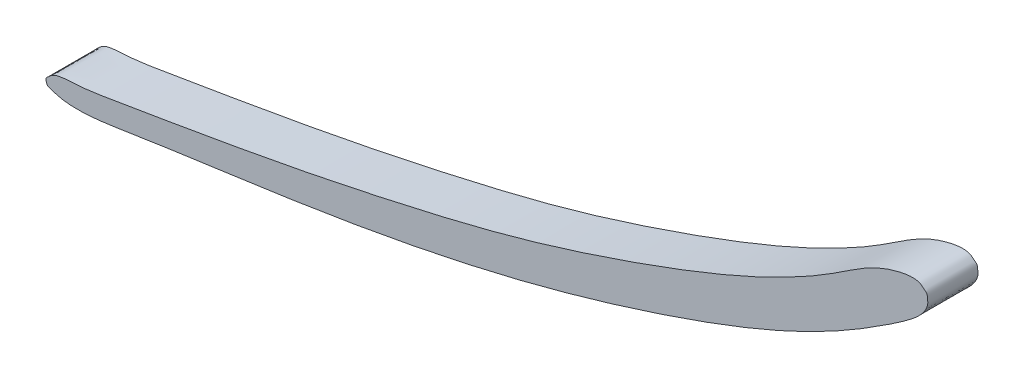
ISO-10303-21;
HEADER;
FILE_DESCRIPTION(('STEP AP214'),'2;1');
FILE_NAME('part.step','',(''),(''),'','','');
FILE_SCHEMA(('AUTOMOTIVE_DESIGN { 1 0 10303 214 1 1 1 1 }'));
ENDSEC;
DATA;
#1=APPLICATION_CONTEXT('core data for automotive mechanical design processes');
#2=APPLICATION_PROTOCOL_DEFINITION('international standard','automotive_design',2000,#1);
#3=PRODUCT_CONTEXT('',#1,'mechanical');
#4=PRODUCT('Part','Part','',(#3));
#5=PRODUCT_RELATED_PRODUCT_CATEGORY('part','',(#4));
#6=PRODUCT_DEFINITION_FORMATION('','',#4);
#7=PRODUCT_DEFINITION_CONTEXT('part definition',#1,'design');
#8=PRODUCT_DEFINITION('design','',#6,#7);
#9=PRODUCT_DEFINITION_SHAPE('','',#8);
#10=(LENGTH_UNIT() NAMED_UNIT(*) SI_UNIT(.MILLI.,.METRE.));
#11=(NAMED_UNIT(*) PLANE_ANGLE_UNIT() SI_UNIT($,.RADIAN.));
#12=(NAMED_UNIT(*) SI_UNIT($,.STERADIAN.) SOLID_ANGLE_UNIT());
#13=UNCERTAINTY_MEASURE_WITH_UNIT(LENGTH_MEASURE(1.E-05),#10,'distance_accuracy_value','');
#14=(GEOMETRIC_REPRESENTATION_CONTEXT(3) GLOBAL_UNCERTAINTY_ASSIGNED_CONTEXT((#13)) GLOBAL_UNIT_ASSIGNED_CONTEXT((#10,
#11,#12)) REPRESENTATION_CONTEXT('',''));
#15=CARTESIAN_POINT('',(0.,0.,0.));
#16=DIRECTION('',(0.,0.,1.));
#17=DIRECTION('',(1.,0.,0.));
#18=AXIS2_PLACEMENT_3D('',#15,#16,#17);
#19=CARTESIAN_POINT('',(84.9771446349662,0.,300.));
#20=CARTESIAN_POINT('',(84.9376325896972,0.0930859776475884,300.));
#21=CARTESIAN_POINT('',(84.866558012268,0.164900258516924,300.));
#22=CARTESIAN_POINT('',(84.7197326632343,0.299874831501848,300.));
#23=CARTESIAN_POINT('',(84.6423906662076,0.362790942592253,300.));
#24=CARTESIAN_POINT('',(84.4144135615283,0.556249545859326,300.));
#25=CARTESIAN_POINT('',(84.2625021657616,0.68714906267718,300.));
#26=CARTESIAN_POINT('',(84.0164333167326,0.853211526667667,300.));
#27=CARTESIAN_POINT('',(83.9317507670341,0.903849060375523,300.));
#28=CARTESIAN_POINT('',(83.7530700213341,0.988603458442093,300.));
#29=CARTESIAN_POINT('',(83.658539371191,1.02352718001817,300.));
#30=CARTESIAN_POINT('',(83.3700965774024,1.10629901206943,300.));
#31=CARTESIAN_POINT('',(83.1738966304029,1.13265599270806,300.));
#32=CARTESIAN_POINT('',(82.7777030243565,1.15736538586336,300.));
#33=CARTESIAN_POINT('',(82.5773526868236,1.15477537073554,300.));
#34=CARTESIAN_POINT('',(82.1817563658688,1.13505252723554,300.));
#35=CARTESIAN_POINT('',(81.9852938780456,1.11719832651085,300.));
#36=CARTESIAN_POINT('',(81.3994189323479,1.04261651869395,300.));
#37=CARTESIAN_POINT('',(81.0131722697718,0.96694452278221,300.));
#38=CARTESIAN_POINT('',(80.244761884589,0.791167870278928,300.));
#39=CARTESIAN_POINT('',(79.8618140904548,0.688833530788997,300.));
#40=CARTESIAN_POINT('',(79.105910434372,0.460950012632982,300.));
#41=CARTESIAN_POINT('',(78.733294882838,0.335999011476674,300.));
#42=CARTESIAN_POINT('',(77.6306035102437,-0.0701207691458209,300.));
#43=CARTESIAN_POINT('',(76.9162105618885,-0.383644795168771,300.));
#44=CARTESIAN_POINT('',(74.8317995544902,-1.44546046891613,300.));
#45=CARTESIAN_POINT('',(73.5145945461823,-2.30278701936392,300.));
#46=CARTESIAN_POINT('',(71.5456953012737,-3.60271578535651,300.));
#47=CARTESIAN_POINT('',(70.88975405836,-4.03675729397341,300.));
#48=CARTESIAN_POINT('',(69.5699012624653,-4.88856822954685,300.));
#49=CARTESIAN_POINT('',(68.906450999426,-5.3072794200656,300.));
#50=CARTESIAN_POINT('',(66.8978301359272,-6.52611304472367,300.));
#51=CARTESIAN_POINT('',(65.5358677387982,-7.29195356456794,300.));
#52=CARTESIAN_POINT('',(62.7828004318539,-8.764137628327,300.));
#53=CARTESIAN_POINT('',(61.3915859679051,-9.47025750794363,300.));
#54=CARTESIAN_POINT('',(58.5868512966658,-10.8369581508706,300.));
#55=CARTESIAN_POINT('',(57.1725614333965,-11.4959675945166,300.));
#56=CARTESIAN_POINT('',(54.321098644822,-12.7672687191436,300.));
#57=CARTESIAN_POINT('',(52.8843392738792,-13.3804047073471,300.));
#58=CARTESIAN_POINT('',(48.5485751516485,-15.1677807657089,300.));
#59=CARTESIAN_POINT('',(45.6248128434252,-16.2935228877004,300.));
#60=CARTESIAN_POINT('',(39.7397747300732,-18.4595659588936,300.));
#61=CARTESIAN_POINT('',(36.7803399862011,-19.4965308587253,300.));
#62=CARTESIAN_POINT('',(30.8364624773511,-21.4933340248129,300.));
#63=CARTESIAN_POINT('',(27.8525329429936,-22.4535798785453,300.));
#64=CARTESIAN_POINT('',(21.8521034457211,-24.27042958252,300.));
#65=CARTESIAN_POINT('',(18.8336834802562,-25.1236965513815,300.));
#66=CARTESIAN_POINT('',(12.7710550733762,-26.7220107800702,300.));
#67=CARTESIAN_POINT('',(9.72643445547307,-27.4683886409884,300.));
#68=CARTESIAN_POINT('',(3.6215124993033,-28.8989475391605,300.));
#69=CARTESIAN_POINT('',(0.56196516582451,-29.5854321913471,300.));
#70=CARTESIAN_POINT('',(-5.56502059829693,-30.9186426334031,300.));
#71=CARTESIAN_POINT('',(-8.63324977001596,-31.5632638157014,300.));
#72=CARTESIAN_POINT('',(-14.7804008535013,-32.8028745850444,300.));
#73=CARTESIAN_POINT('',(-17.8589302331098,-33.3962812159395,300.));
#74=CARTESIAN_POINT('',(-24.0251266928308,-34.5342554983232,300.));
#75=CARTESIAN_POINT('',(-27.1124240991927,-35.0810875197353,300.));
#76=CARTESIAN_POINT('',(-33.2905772093011,-36.1543440573517,300.));
#77=CARTESIAN_POINT('',(-36.3812654291625,-36.6816800630318,300.));
#78=CARTESIAN_POINT('',(-41.0180780447079,-37.4680162138891,300.));
#79=CARTESIAN_POINT('',(-42.5641390301682,-37.7274205301171,300.));
#80=CARTESIAN_POINT('',(-44.8845707321848,-38.1084529392512,300.));
#81=CARTESIAN_POINT('',(-45.6579658086213,-38.2359863588061,300.));
#82=CARTESIAN_POINT('',(-47.2062258440883,-38.4817030562119,300.));
#83=CARTESIAN_POINT('',(-47.9820073901507,-38.5972411057274,300.));
#84=CARTESIAN_POINT('',(-49.538110817668,-38.7812880257337,300.));
#85=CARTESIAN_POINT('',(-50.3182305121755,-38.8495687425065,300.));
#86=CARTESIAN_POINT('',(-51.491704846137,-38.9141619001389,300.));
#87=CARTESIAN_POINT('',(-51.8834999893309,-38.9319379566898,300.));
#88=CARTESIAN_POINT('',(-52.6631013919235,-38.9972294873429,300.));
#89=CARTESIAN_POINT('',(-53.0507008777088,-39.0412334351955,300.));
#90=CARTESIAN_POINT('',(-53.6208271323259,-39.165407444721,300.));
#91=CARTESIAN_POINT('',(-53.8088589770117,-39.2171715388468,300.));
#92=CARTESIAN_POINT('',(-54.1779577557488,-39.3566383827501,300.));
#93=CARTESIAN_POINT('',(-54.3571544162927,-39.4457454962575,300.));
#94=CARTESIAN_POINT('',(-54.6857138713909,-39.6599024882452,300.));
#95=CARTESIAN_POINT('',(-54.8395037210446,-39.7826492948644,300.));
#96=CARTESIAN_POINT('',(-55.0619862980175,-39.9790207988161,300.));
#97=CARTESIAN_POINT('',(-55.136168961009,-40.0445188101506,300.));
#98=CARTESIAN_POINT('',(-55.2793957616962,-40.1810147548545,300.));
#99=CARTESIAN_POINT('',(-55.3501020785358,-40.250946227061,300.));
#100=CARTESIAN_POINT('',(-55.4289720375346,-40.3776261703138,300.));
#101=CARTESIAN_POINT('',(-55.4490411552293,-40.4226391349302,300.));
#102=CARTESIAN_POINT('',(-55.4715465373486,-40.5194301459514,300.));
#103=CARTESIAN_POINT('',(-55.4744405832507,-40.5690045459335,300.));
#104=CARTESIAN_POINT('',(-55.4679190855987,-40.7166887430779,300.));
#105=CARTESIAN_POINT('',(-55.4448174277775,-40.8137763116324,300.));
#106=CARTESIAN_POINT('',(-55.3923292373281,-41.0031256287222,300.));
#107=CARTESIAN_POINT('',(-55.3619092650003,-41.0979944371105,300.));
#108=CARTESIAN_POINT('',(-55.271967798988,-41.273212021774,300.));
#109=CARTESIAN_POINT('',(-55.206745335113,-41.3514819357863,300.));
#110=CARTESIAN_POINT('',(-55.0356883292095,-41.4536012578485,300.));
#111=CARTESIAN_POINT('',(-54.9405601794301,-41.478138877241,300.));
#112=CARTESIAN_POINT('',(-54.7513899157423,-41.5269082833019,300.));
#113=CARTESIAN_POINT('',(-54.656991411335,-41.551801110247,300.));
#114=CARTESIAN_POINT('',(-54.3753173947961,-41.6319078434269,300.));
#115=CARTESIAN_POINT('',(-54.1897455613133,-41.6937998687081,300.));
#116=CARTESIAN_POINT('',(-53.8173796025099,-41.8128914825379,300.));
#117=CARTESIAN_POINT('',(-53.630403228756,-41.8693914106483,300.));
#118=CARTESIAN_POINT('',(-53.2514970052677,-41.9633746360396,300.));
#119=CARTESIAN_POINT('',(-53.0598285368258,-42.001861388584,300.));
#120=CARTESIAN_POINT('',(-52.4804260042969,-42.1004408649109,300.));
#121=CARTESIAN_POINT('',(-52.0916240968118,-42.1417814357258,300.));
#122=CARTESIAN_POINT('',(-50.93118963316,-42.2308310088091,300.));
#123=CARTESIAN_POINT('',(-50.1596518014517,-42.2360744620239,300.));
#124=CARTESIAN_POINT('',(-48.6196425931976,-42.1669670911243,300.));
#125=CARTESIAN_POINT('',(-47.8510981429154,-42.094513001492,300.));
#126=CARTESIAN_POINT('',(-46.3152190154037,-41.9182034135112,300.));
#127=CARTESIAN_POINT('',(-45.5477066729545,-41.8129926974635,300.));
#128=CARTESIAN_POINT('',(-43.2476069822877,-41.4794572556816,300.));
#129=CARTESIAN_POINT('',(-41.7172258487907,-41.2371272701866,300.));
#130=CARTESIAN_POINT('',(-38.6539342513886,-40.7692026629085,300.));
#131=CARTESIAN_POINT('',(-37.1214642438679,-40.5406285918074,300.));
#132=CARTESIAN_POINT('',(-32.5209606344463,-39.8767584760173,300.));
#133=CARTESIAN_POINT('',(-29.4505925645386,-39.4576012866095,300.));
#134=CARTESIAN_POINT('',(-23.3118192098203,-38.6057053528583,300.));
#135=CARTESIAN_POINT('',(-20.2433613892938,-38.1736918175599,300.));
#136=CARTESIAN_POINT('',(-11.04880325248,-36.8070255887844,300.));
#137=CARTESIAN_POINT('',(-4.9319100127467,-35.8008028634233,300.));
#138=CARTESIAN_POINT('',(7.24834813249166,-33.492575457836,300.));
#139=CARTESIAN_POINT('',(13.3121697935028,-32.1938332666301,300.));
#140=CARTESIAN_POINT('',(25.345409445514,-29.2191754580631,300.));
#141=CARTESIAN_POINT('',(31.316238608083,-27.5430370446146,300.));
#142=CARTESIAN_POINT('',(40.1903196139511,-24.7692964175808,300.));
#143=CARTESIAN_POINT('',(43.1359193713343,-23.8024161108653,300.));
#144=CARTESIAN_POINT('',(48.9909662648283,-21.7725789819534,300.));
#145=CARTESIAN_POINT('',(51.9016078482012,-20.7105550780109,300.));
#146=CARTESIAN_POINT('',(57.6726827579912,-18.4464115391916,300.));
#147=CARTESIAN_POINT('',(60.5308669735177,-17.2453625712614,300.));
#148=CARTESIAN_POINT('',(66.1527300618198,-14.6373269703479,300.));
#149=CARTESIAN_POINT('',(68.9165389957067,-13.2260336972963,300.));
#150=CARTESIAN_POINT('',(74.3111862531582,-10.1704170614425,300.));
#151=CARTESIAN_POINT('',(76.9439455989904,-8.52680577070169,300.));
#152=CARTESIAN_POINT('',(80.1586328343634,-6.36116801998172,300.));
#153=CARTESIAN_POINT('',(80.7982061573963,-5.92262525758618,300.));
#154=CARTESIAN_POINT('',(81.7422176701925,-5.24391096078316,300.));
#155=CARTESIAN_POINT('',(82.0537041363697,-5.01330238364296,300.));
#156=CARTESIAN_POINT('',(82.6658868732541,-4.53727437822524,300.));
#157=CARTESIAN_POINT('',(82.9666380284635,-4.29285597419744,300.));
#158=CARTESIAN_POINT('',(83.5427396999458,-3.7783632631757,300.));
#159=CARTESIAN_POINT('',(83.8184478046357,-3.5082811754936,300.));
#160=CARTESIAN_POINT('',(84.3271657392073,-2.92371324399608,300.));
#161=CARTESIAN_POINT('',(84.5586186327069,-2.60655584994662,300.));
#162=CARTESIAN_POINT('',(84.8390339395576,-2.09776670116639,300.));
#163=CARTESIAN_POINT('',(84.9227257281224,-1.92096148548556,300.));
#164=CARTESIAN_POINT('',(85.05127879664,-1.55191923846991,300.));
#165=CARTESIAN_POINT('',(85.0961742702333,-1.36320120662389,300.));
#166=CARTESIAN_POINT('',(85.1137085898208,-0.970118195218622,300.));
#167=CARTESIAN_POINT('',(85.0833613645896,-0.774977119927098,300.));
#168=CARTESIAN_POINT('',(85.0441208025226,-0.483260492620629,300.));
#169=CARTESIAN_POINT('',(85.0354551205903,-0.3856180459147,300.));
#170=CARTESIAN_POINT('',(85.0200086601555,-0.190160835975641,300.));
#171=CARTESIAN_POINT('',(85.0166566802352,-0.0930859776475801,300.));
#172=CARTESIAN_POINT('',(84.9771446349662,0.,300.));
#173=B_SPLINE_CURVE_WITH_KNOTS('',3,(#19,#20,#21,#22,#23,#24,#25,#26,#27,#28,#29,#30,#31,#32,
#33,#34,#35,#36,#37,#38,#39,#40,#41,#42,#43,#44,#45,#46,#47,#48,#49,#50,#51,#52,#53,#54,#55,#56,
#57,#58,#59,#60,#61,#62,#63,#64,#65,#66,#67,#68,#69,#70,#71,#72,#73,#74,#75,#76,#77,#78,#79,#80,
#81,#82,#83,#84,#85,#86,#87,#88,#89,#90,#91,#92,#93,#94,#95,#96,#97,#98,#99,#100,#101,#102,#103,
#104,#105,#106,#107,#108,#109,#110,#111,#112,#113,#114,#115,#116,#117,#118,#119,#120,#121,#122,
#123,#124,#125,#126,#127,#128,#129,#130,#131,#132,#133,#134,#135,#136,#137,#138,#139,#140,#141,
#142,#143,#144,#145,#146,#147,#148,#149,#150,#151,#152,#153,#154,#155,#156,#157,#158,#159,#160,
#161,#162,#163,#164,#165,#166,#167,#168,#169,#170,#171,#172),.UNSPECIFIED.,.T.,.F.,(4,2,2,2,2,2,
2,2,2,2,2,2,2,2,2,2,2,2,2,2,2,2,2,2,2,2,2,2,2,2,2,2,2,2,2,2,2,2,2,2,2,2,2,2,2,2,2,2,2,2,2,2,2,2,
2,2,2,2,2,2,2,2,2,2,2,2,2,2,2,2,2,2,2,2,2,2,4),(0.,0.000976562500000106,0.00195312500000021,
0.00390625000000042,0.00488281250000047,0.00585937500000052,0.00781250000000049,
0.00976562500000046,0.0117187500000004,0.0156250000000004,0.0195312500000003,0.0234375000000002,
0.0312500000000001,0.0468749999999997,0.0546874999999996,0.0624999999999995,0.0781249999999992,
0.093749999999999,0.109374999999999,0.124999999999998,0.156249999999998,0.187499999999997,
0.218749999999997,0.249999999999996,0.281249999999996,0.312499999999995,0.343749999999995,
0.374999999999994,0.406249999999993,0.437499999999993,0.453124999999993,0.460937499999992,
0.468749999999992,0.476562499999992,0.480468749999992,0.484374999999992,0.486328124999992,
0.488281249999992,0.490234374999992,0.491210937499992,0.492187499999992,0.492675781249992,
0.493164062499992,0.494140624999992,0.495117187499992,0.496093749999992,0.497070312499992,
0.498046874999993,0.499999999999993,0.501953124999993,0.503906249999993,0.507812499999993,
0.515624999999993,0.523437499999993,0.531249999999993,0.546874999999993,0.562499999999993,
0.593749999999994,0.624999999999994,0.687499999999995,0.749999999999996,0.812499999999997,
0.843749999999998,0.874999999999998,0.906249999999999,0.937499999999999,0.96875,0.9765625,
0.98046875,0.984375,0.98828125,0.9921875,0.994140625,0.99609375,0.998046875,0.9990234375,1.),.UNSPECIFIED.);
#174=DIRECTION('',(0.,0.,-1.));
#175=VECTOR('',#174,1.);
#176=SURFACE_OF_LINEAR_EXTRUSION('',#173,#175);
#177=CARTESIAN_POINT('',(84.9771446349662,0.,300.));
#178=CARTESIAN_POINT('',(85.0166566802352,-0.0930859776475801,300.));
#179=CARTESIAN_POINT('',(85.0200086601555,-0.190160835975641,300.));
#180=CARTESIAN_POINT('',(85.0354551205903,-0.3856180459147,300.));
#181=CARTESIAN_POINT('',(85.0441208025226,-0.483260492620629,300.));
#182=CARTESIAN_POINT('',(85.0833613645896,-0.774977119927098,300.));
#183=CARTESIAN_POINT('',(85.1137085898208,-0.970118195218622,300.));
#184=CARTESIAN_POINT('',(85.0961742702333,-1.36320120662389,300.));
#185=CARTESIAN_POINT('',(85.05127879664,-1.55191923846991,300.));
#186=CARTESIAN_POINT('',(84.9227257281224,-1.92096148548556,300.));
#187=CARTESIAN_POINT('',(84.8390339395576,-2.09776670116639,300.));
#188=CARTESIAN_POINT('',(84.5586186327069,-2.60655584994662,300.));
#189=CARTESIAN_POINT('',(84.3271657392073,-2.92371324399608,300.));
#190=CARTESIAN_POINT('',(83.8184478046357,-3.5082811754936,300.));
#191=CARTESIAN_POINT('',(83.5427396999458,-3.7783632631757,300.));
#192=CARTESIAN_POINT('',(82.9666380284635,-4.29285597419744,300.));
#193=CARTESIAN_POINT('',(82.6658868732541,-4.53727437822524,300.));
#194=CARTESIAN_POINT('',(82.0537041363697,-5.01330238364296,300.));
#195=CARTESIAN_POINT('',(81.7422176701925,-5.24391096078316,300.));
#196=CARTESIAN_POINT('',(80.7982061573963,-5.92262525758618,300.));
#197=CARTESIAN_POINT('',(80.1586328343634,-6.36116801998172,300.));
#198=CARTESIAN_POINT('',(76.9439455989904,-8.52680577070169,300.));
#199=CARTESIAN_POINT('',(74.3111862531582,-10.1704170614425,300.));
#200=CARTESIAN_POINT('',(68.9165389957067,-13.2260336972963,300.));
#201=CARTESIAN_POINT('',(66.1527300618198,-14.6373269703479,300.));
#202=CARTESIAN_POINT('',(60.5308669735177,-17.2453625712614,300.));
#203=CARTESIAN_POINT('',(57.6726827579912,-18.4464115391916,300.));
#204=CARTESIAN_POINT('',(51.9016078482012,-20.7105550780109,300.));
#205=CARTESIAN_POINT('',(48.9909662648283,-21.7725789819534,300.));
#206=CARTESIAN_POINT('',(43.1359193713343,-23.8024161108653,300.));
#207=CARTESIAN_POINT('',(40.1903196139511,-24.7692964175808,300.));
#208=CARTESIAN_POINT('',(31.316238608083,-27.5430370446146,300.));
#209=CARTESIAN_POINT('',(25.345409445514,-29.2191754580631,300.));
#210=CARTESIAN_POINT('',(13.3121697935028,-32.1938332666301,300.));
#211=CARTESIAN_POINT('',(7.24834813249166,-33.492575457836,300.));
#212=CARTESIAN_POINT('',(-4.9319100127467,-35.8008028634233,300.));
#213=CARTESIAN_POINT('',(-11.04880325248,-36.8070255887844,300.));
#214=CARTESIAN_POINT('',(-20.2433613892938,-38.1736918175599,300.));
#215=CARTESIAN_POINT('',(-23.3118192098203,-38.6057053528583,300.));
#216=CARTESIAN_POINT('',(-29.4505925645386,-39.4576012866095,300.));
#217=CARTESIAN_POINT('',(-32.5209606344463,-39.8767584760173,300.));
#218=CARTESIAN_POINT('',(-37.1214642438679,-40.5406285918074,300.));
#219=CARTESIAN_POINT('',(-38.6539342513886,-40.7692026629085,300.));
#220=CARTESIAN_POINT('',(-41.7172258487907,-41.2371272701866,300.));
#221=CARTESIAN_POINT('',(-43.2476069822877,-41.4794572556816,300.));
#222=CARTESIAN_POINT('',(-45.5477066729545,-41.8129926974635,300.));
#223=CARTESIAN_POINT('',(-46.3152190154037,-41.9182034135112,300.));
#224=CARTESIAN_POINT('',(-47.8510981429154,-42.094513001492,300.));
#225=CARTESIAN_POINT('',(-48.6196425931976,-42.1669670911243,300.));
#226=CARTESIAN_POINT('',(-50.1596518014517,-42.2360744620239,300.));
#227=CARTESIAN_POINT('',(-50.93118963316,-42.2308310088091,300.));
#228=CARTESIAN_POINT('',(-52.0916240968118,-42.1417814357258,300.));
#229=CARTESIAN_POINT('',(-52.4804260042969,-42.1004408649109,300.));
#230=CARTESIAN_POINT('',(-53.0598285368258,-42.001861388584,300.));
#231=CARTESIAN_POINT('',(-53.2514970052677,-41.9633746360396,300.));
#232=CARTESIAN_POINT('',(-53.630403228756,-41.8693914106483,300.));
#233=CARTESIAN_POINT('',(-53.8173796025099,-41.8128914825379,300.));
#234=CARTESIAN_POINT('',(-54.1897455613133,-41.6937998687081,300.));
#235=CARTESIAN_POINT('',(-54.3753173947961,-41.6319078434269,300.));
#236=CARTESIAN_POINT('',(-54.656991411335,-41.551801110247,300.));
#237=CARTESIAN_POINT('',(-54.7513899157423,-41.5269082833019,300.));
#238=CARTESIAN_POINT('',(-54.9405601794301,-41.478138877241,300.));
#239=CARTESIAN_POINT('',(-55.0356883292095,-41.4536012578485,300.));
#240=CARTESIAN_POINT('',(-55.206745335113,-41.3514819357863,300.));
#241=CARTESIAN_POINT('',(-55.271967798988,-41.273212021774,300.));
#242=CARTESIAN_POINT('',(-55.3619092650003,-41.0979944371105,300.));
#243=CARTESIAN_POINT('',(-55.3923292373281,-41.0031256287222,300.));
#244=CARTESIAN_POINT('',(-55.4448174277775,-40.8137763116324,300.));
#245=CARTESIAN_POINT('',(-55.4679190855987,-40.7166887430779,300.));
#246=CARTESIAN_POINT('',(-55.4744405832507,-40.5690045459335,300.));
#247=CARTESIAN_POINT('',(-55.4715465373486,-40.5194301459514,300.));
#248=CARTESIAN_POINT('',(-55.4490411552293,-40.4226391349302,300.));
#249=CARTESIAN_POINT('',(-55.4289720375346,-40.3776261703138,300.));
#250=CARTESIAN_POINT('',(-55.3501020785358,-40.250946227061,300.));
#251=CARTESIAN_POINT('',(-55.2793957616962,-40.1810147548545,300.));
#252=CARTESIAN_POINT('',(-55.136168961009,-40.0445188101506,300.));
#253=CARTESIAN_POINT('',(-55.0619862980175,-39.9790207988161,300.));
#254=CARTESIAN_POINT('',(-54.8395037210446,-39.7826492948644,300.));
#255=CARTESIAN_POINT('',(-54.6857138713909,-39.6599024882452,300.));
#256=CARTESIAN_POINT('',(-54.3571544162927,-39.4457454962575,300.));
#257=CARTESIAN_POINT('',(-54.1779577557488,-39.3566383827501,300.));
#258=CARTESIAN_POINT('',(-53.8088589770117,-39.2171715388468,300.));
#259=CARTESIAN_POINT('',(-53.6208271323259,-39.165407444721,300.));
#260=CARTESIAN_POINT('',(-53.0507008777088,-39.0412334351955,300.));
#261=CARTESIAN_POINT('',(-52.6631013919235,-38.9972294873429,300.));
#262=CARTESIAN_POINT('',(-51.8834999893309,-38.9319379566898,300.));
#263=CARTESIAN_POINT('',(-51.491704846137,-38.9141619001389,300.));
#264=CARTESIAN_POINT('',(-50.3182305121755,-38.8495687425065,300.));
#265=CARTESIAN_POINT('',(-49.538110817668,-38.7812880257337,300.));
#266=CARTESIAN_POINT('',(-47.9820073901507,-38.5972411057274,300.));
#267=CARTESIAN_POINT('',(-47.2062258440883,-38.4817030562119,300.));
#268=CARTESIAN_POINT('',(-45.6579658086213,-38.2359863588061,300.));
#269=CARTESIAN_POINT('',(-44.8845707321848,-38.1084529392512,300.));
#270=CARTESIAN_POINT('',(-42.5641390301682,-37.7274205301171,300.));
#271=CARTESIAN_POINT('',(-41.0180780447079,-37.4680162138891,300.));
#272=CARTESIAN_POINT('',(-36.3812654291625,-36.6816800630318,300.));
#273=CARTESIAN_POINT('',(-33.2905772093011,-36.1543440573517,300.));
#274=CARTESIAN_POINT('',(-27.1124240991927,-35.0810875197353,300.));
#275=CARTESIAN_POINT('',(-24.0251266928308,-34.5342554983232,300.));
#276=CARTESIAN_POINT('',(-17.8589302331098,-33.3962812159395,300.));
#277=CARTESIAN_POINT('',(-14.7804008535013,-32.8028745850444,300.));
#278=CARTESIAN_POINT('',(-8.63324977001596,-31.5632638157014,300.));
#279=CARTESIAN_POINT('',(-5.56502059829693,-30.9186426334031,300.));
#280=CARTESIAN_POINT('',(0.56196516582451,-29.5854321913471,300.));
#281=CARTESIAN_POINT('',(3.6215124993033,-28.8989475391605,300.));
#282=CARTESIAN_POINT('',(9.72643445547307,-27.4683886409884,300.));
#283=CARTESIAN_POINT('',(12.7710550733762,-26.7220107800702,300.));
#284=CARTESIAN_POINT('',(18.8336834802562,-25.1236965513815,300.));
#285=CARTESIAN_POINT('',(21.8521034457211,-24.27042958252,300.));
#286=CARTESIAN_POINT('',(27.8525329429936,-22.4535798785453,300.));
#287=CARTESIAN_POINT('',(30.8364624773511,-21.4933340248129,300.));
#288=CARTESIAN_POINT('',(36.7803399862011,-19.4965308587253,300.));
#289=CARTESIAN_POINT('',(39.7397747300732,-18.4595659588936,300.));
#290=CARTESIAN_POINT('',(45.6248128434252,-16.2935228877004,300.));
#291=CARTESIAN_POINT('',(48.5485751516485,-15.1677807657089,300.));
#292=CARTESIAN_POINT('',(52.8843392738792,-13.3804047073471,300.));
#293=CARTESIAN_POINT('',(54.321098644822,-12.7672687191436,300.));
#294=CARTESIAN_POINT('',(57.1725614333965,-11.4959675945166,300.));
#295=CARTESIAN_POINT('',(58.5868512966658,-10.8369581508706,300.));
#296=CARTESIAN_POINT('',(61.3915859679051,-9.47025750794363,300.));
#297=CARTESIAN_POINT('',(62.7828004318539,-8.764137628327,300.));
#298=CARTESIAN_POINT('',(65.5358677387982,-7.29195356456794,300.));
#299=CARTESIAN_POINT('',(66.8978301359272,-6.52611304472367,300.));
#300=CARTESIAN_POINT('',(68.906450999426,-5.3072794200656,300.));
#301=CARTESIAN_POINT('',(69.5699012624653,-4.88856822954685,300.));
#302=CARTESIAN_POINT('',(70.88975405836,-4.03675729397341,300.));
#303=CARTESIAN_POINT('',(71.5456953012737,-3.60271578535651,300.));
#304=CARTESIAN_POINT('',(73.5145945461823,-2.30278701936392,300.));
#305=CARTESIAN_POINT('',(74.8317995544902,-1.44546046891613,300.));
#306=CARTESIAN_POINT('',(76.9162105618885,-0.383644795168771,300.));
#307=CARTESIAN_POINT('',(77.6306035102437,-0.0701207691458209,300.));
#308=CARTESIAN_POINT('',(78.733294882838,0.335999011476674,300.));
#309=CARTESIAN_POINT('',(79.105910434372,0.460950012632982,300.));
#310=CARTESIAN_POINT('',(79.8618140904548,0.688833530788997,300.));
#311=CARTESIAN_POINT('',(80.244761884589,0.791167870278928,300.));
#312=CARTESIAN_POINT('',(81.0131722697718,0.96694452278221,300.));
#313=CARTESIAN_POINT('',(81.3994189323479,1.04261651869395,300.));
#314=CARTESIAN_POINT('',(81.9852938780456,1.11719832651085,300.));
#315=CARTESIAN_POINT('',(82.1817563658688,1.13505252723554,300.));
#316=CARTESIAN_POINT('',(82.5773526868236,1.15477537073554,300.));
#317=CARTESIAN_POINT('',(82.7777030243565,1.15736538586336,300.));
#318=CARTESIAN_POINT('',(83.1738966304029,1.13265599270806,300.));
#319=CARTESIAN_POINT('',(83.3700965774024,1.10629901206943,300.));
#320=CARTESIAN_POINT('',(83.658539371191,1.02352718001817,300.));
#321=CARTESIAN_POINT('',(83.7530700213341,0.988603458442093,300.));
#322=CARTESIAN_POINT('',(83.9317507670341,0.903849060375523,300.));
#323=CARTESIAN_POINT('',(84.0164333167326,0.853211526667667,300.));
#324=CARTESIAN_POINT('',(84.2625021657616,0.68714906267718,300.));
#325=CARTESIAN_POINT('',(84.4144135615283,0.556249545859326,300.));
#326=CARTESIAN_POINT('',(84.6423906662076,0.362790942592253,300.));
#327=CARTESIAN_POINT('',(84.7197326632343,0.299874831501848,300.));
#328=CARTESIAN_POINT('',(84.866558012268,0.164900258516924,300.));
#329=CARTESIAN_POINT('',(84.9376325896972,0.0930859776475884,300.));
#330=CARTESIAN_POINT('',(84.9771446349662,0.,300.));
#331=B_SPLINE_CURVE_WITH_KNOTS('',3,(#177,#178,#179,#180,#181,#182,#183,#184,#185,#186,#187,
#188,#189,#190,#191,#192,#193,#194,#195,#196,#197,#198,#199,#200,#201,#202,#203,#204,#205,#206,
#207,#208,#209,#210,#211,#212,#213,#214,#215,#216,#217,#218,#219,#220,#221,#222,#223,#224,#225,
#226,#227,#228,#229,#230,#231,#232,#233,#234,#235,#236,#237,#238,#239,#240,#241,#242,#243,#244,
#245,#246,#247,#248,#249,#250,#251,#252,#253,#254,#255,#256,#257,#258,#259,#260,#261,#262,#263,
#264,#265,#266,#267,#268,#269,#270,#271,#272,#273,#274,#275,#276,#277,#278,#279,#280,#281,#282,
#283,#284,#285,#286,#287,#288,#289,#290,#291,#292,#293,#294,#295,#296,#297,#298,#299,#300,#301,
#302,#303,#304,#305,#306,#307,#308,#309,#310,#311,#312,#313,#314,#315,#316,#317,#318,#319,#320,
#321,#322,#323,#324,#325,#326,#327,#328,#329,#330),.UNSPECIFIED.,.T.,.F.,(4,2,2,2,2,2,2,2,2,2,2,
2,2,2,2,2,2,2,2,2,2,2,2,2,2,2,2,2,2,2,2,2,2,2,2,2,2,2,2,2,2,2,2,2,2,2,2,2,2,2,2,2,2,2,2,2,2,2,2,
2,2,2,2,2,2,2,2,2,2,2,2,2,2,2,2,2,4),(0.,0.0009765625,0.001953125,0.00390625,0.005859375,
0.0078125,0.01171875,0.0156250000000001,0.0195312500000002,0.0234375000000003,
0.0312500000000004,0.062500000000001,0.0937500000000014,0.125000000000002,0.156250000000002,
0.187500000000003,0.250000000000004,0.312500000000005,0.375000000000006,0.406250000000006,
0.437500000000007,0.453125000000007,0.468750000000007,0.476562500000007,0.484375000000007,
0.492187500000007,0.496093750000007,0.498046875000007,0.500000000000007,0.501953125000008,
0.502929687500008,0.503906250000008,0.504882812500008,0.505859375000008,0.506835937500008,
0.507324218750008,0.507812500000008,0.508789062500008,0.509765625000008,0.511718750000008,
0.513671875000008,0.515625000000008,0.519531250000008,0.523437500000008,0.531250000000008,
0.539062500000008,0.546875000000007,0.562500000000007,0.593750000000007,0.625000000000006,
0.656250000000005,0.687500000000005,0.718750000000004,0.750000000000004,0.781250000000003,
0.812500000000003,0.843750000000002,0.875000000000002,0.890625000000001,0.906250000000001,
0.921875000000001,0.937500000000001,0.9453125,0.953125,0.96875,0.9765625,0.98046875,0.984375,
0.98828125,0.990234375,0.9921875,0.994140624999999,0.9951171875,0.99609375,0.998046875,
0.9990234375,1.),.UNSPECIFIED.);
#332=CARTESIAN_POINT('',(84.9771446349662,0.,300.));
#333=VERTEX_POINT('',#332);
#334=EDGE_CURVE('E10',#333,#333,#331,.F.);
#335=ORIENTED_EDGE('',*,*,#334,.F.);
#336=EDGE_LOOP('',(#335));
#337=FACE_BOUND('',#336,.T.);
#338=CARTESIAN_POINT('',(84.9771446349662,0.,292.));
#339=CARTESIAN_POINT('',(84.9376325896972,0.0930859776475884,292.));
#340=CARTESIAN_POINT('',(84.866558012268,0.164900258516924,292.));
#341=CARTESIAN_POINT('',(84.7197326632343,0.299874831501848,292.));
#342=CARTESIAN_POINT('',(84.6423906662076,0.362790942592253,292.));
#343=CARTESIAN_POINT('',(84.4144135615283,0.556249545859326,292.));
#344=CARTESIAN_POINT('',(84.2625021657616,0.68714906267718,292.));
#345=CARTESIAN_POINT('',(84.0164333167326,0.853211526667667,292.));
#346=CARTESIAN_POINT('',(83.9317507670341,0.903849060375523,292.));
#347=CARTESIAN_POINT('',(83.7530700213341,0.988603458442093,292.));
#348=CARTESIAN_POINT('',(83.658539371191,1.02352718001817,292.));
#349=CARTESIAN_POINT('',(83.3700965774024,1.10629901206943,292.));
#350=CARTESIAN_POINT('',(83.1738966304029,1.13265599270806,292.));
#351=CARTESIAN_POINT('',(82.7777030243565,1.15736538586336,292.));
#352=CARTESIAN_POINT('',(82.5773526868236,1.15477537073554,292.));
#353=CARTESIAN_POINT('',(82.1817563658688,1.13505252723554,292.));
#354=CARTESIAN_POINT('',(81.9852938780456,1.11719832651085,292.));
#355=CARTESIAN_POINT('',(81.3994189323479,1.04261651869395,292.));
#356=CARTESIAN_POINT('',(81.0131722697718,0.96694452278221,292.));
#357=CARTESIAN_POINT('',(80.244761884589,0.791167870278928,292.));
#358=CARTESIAN_POINT('',(79.8618140904548,0.688833530788997,292.));
#359=CARTESIAN_POINT('',(79.105910434372,0.460950012632982,292.));
#360=CARTESIAN_POINT('',(78.733294882838,0.335999011476674,292.));
#361=CARTESIAN_POINT('',(77.6306035102437,-0.0701207691458209,292.));
#362=CARTESIAN_POINT('',(76.9162105618885,-0.383644795168771,292.));
#363=CARTESIAN_POINT('',(74.8317995544902,-1.44546046891613,292.));
#364=CARTESIAN_POINT('',(73.5145945461823,-2.30278701936392,292.));
#365=CARTESIAN_POINT('',(71.5456953012737,-3.60271578535651,292.));
#366=CARTESIAN_POINT('',(70.88975405836,-4.03675729397341,292.));
#367=CARTESIAN_POINT('',(69.5699012624653,-4.88856822954685,292.));
#368=CARTESIAN_POINT('',(68.906450999426,-5.3072794200656,292.));
#369=CARTESIAN_POINT('',(66.8978301359272,-6.52611304472367,292.));
#370=CARTESIAN_POINT('',(65.5358677387982,-7.29195356456794,292.));
#371=CARTESIAN_POINT('',(62.7828004318539,-8.764137628327,292.));
#372=CARTESIAN_POINT('',(61.3915859679051,-9.47025750794363,292.));
#373=CARTESIAN_POINT('',(58.5868512966658,-10.8369581508706,292.));
#374=CARTESIAN_POINT('',(57.1725614333965,-11.4959675945166,292.));
#375=CARTESIAN_POINT('',(54.321098644822,-12.7672687191436,292.));
#376=CARTESIAN_POINT('',(52.8843392738792,-13.3804047073471,292.));
#377=CARTESIAN_POINT('',(48.5485751516485,-15.1677807657089,292.));
#378=CARTESIAN_POINT('',(45.6248128434252,-16.2935228877004,292.));
#379=CARTESIAN_POINT('',(39.7397747300732,-18.4595659588936,292.));
#380=CARTESIAN_POINT('',(36.7803399862011,-19.4965308587253,292.));
#381=CARTESIAN_POINT('',(30.8364624773511,-21.4933340248129,292.));
#382=CARTESIAN_POINT('',(27.8525329429936,-22.4535798785453,292.));
#383=CARTESIAN_POINT('',(21.8521034457211,-24.27042958252,292.));
#384=CARTESIAN_POINT('',(18.8336834802562,-25.1236965513815,292.));
#385=CARTESIAN_POINT('',(12.7710550733762,-26.7220107800702,292.));
#386=CARTESIAN_POINT('',(9.72643445547307,-27.4683886409884,292.));
#387=CARTESIAN_POINT('',(3.6215124993033,-28.8989475391605,292.));
#388=CARTESIAN_POINT('',(0.56196516582451,-29.5854321913471,292.));
#389=CARTESIAN_POINT('',(-5.56502059829693,-30.9186426334031,292.));
#390=CARTESIAN_POINT('',(-8.63324977001596,-31.5632638157014,292.));
#391=CARTESIAN_POINT('',(-14.7804008535013,-32.8028745850444,292.));
#392=CARTESIAN_POINT('',(-17.8589302331098,-33.3962812159395,292.));
#393=CARTESIAN_POINT('',(-24.0251266928308,-34.5342554983232,292.));
#394=CARTESIAN_POINT('',(-27.1124240991927,-35.0810875197353,292.));
#395=CARTESIAN_POINT('',(-33.2905772093011,-36.1543440573517,292.));
#396=CARTESIAN_POINT('',(-36.3812654291625,-36.6816800630318,292.));
#397=CARTESIAN_POINT('',(-41.0180780447079,-37.4680162138891,292.));
#398=CARTESIAN_POINT('',(-42.5641390301682,-37.7274205301171,292.));
#399=CARTESIAN_POINT('',(-44.8845707321848,-38.1084529392512,292.));
#400=CARTESIAN_POINT('',(-45.6579658086213,-38.2359863588061,292.));
#401=CARTESIAN_POINT('',(-47.2062258440883,-38.4817030562119,292.));
#402=CARTESIAN_POINT('',(-47.9820073901507,-38.5972411057274,292.));
#403=CARTESIAN_POINT('',(-49.538110817668,-38.7812880257337,292.));
#404=CARTESIAN_POINT('',(-50.3182305121755,-38.8495687425065,292.));
#405=CARTESIAN_POINT('',(-51.491704846137,-38.9141619001389,292.));
#406=CARTESIAN_POINT('',(-51.8834999893309,-38.9319379566898,292.));
#407=CARTESIAN_POINT('',(-52.6631013919235,-38.9972294873429,292.));
#408=CARTESIAN_POINT('',(-53.0507008777088,-39.0412334351955,292.));
#409=CARTESIAN_POINT('',(-53.6208271323259,-39.165407444721,292.));
#410=CARTESIAN_POINT('',(-53.8088589770117,-39.2171715388468,292.));
#411=CARTESIAN_POINT('',(-54.1779577557488,-39.3566383827501,292.));
#412=CARTESIAN_POINT('',(-54.3571544162927,-39.4457454962575,292.));
#413=CARTESIAN_POINT('',(-54.6857138713909,-39.6599024882452,292.));
#414=CARTESIAN_POINT('',(-54.8395037210446,-39.7826492948644,292.));
#415=CARTESIAN_POINT('',(-55.0619862980175,-39.9790207988161,292.));
#416=CARTESIAN_POINT('',(-55.136168961009,-40.0445188101506,292.));
#417=CARTESIAN_POINT('',(-55.2793957616962,-40.1810147548545,292.));
#418=CARTESIAN_POINT('',(-55.3501020785358,-40.250946227061,292.));
#419=CARTESIAN_POINT('',(-55.4289720375346,-40.3776261703138,292.));
#420=CARTESIAN_POINT('',(-55.4490411552293,-40.4226391349302,292.));
#421=CARTESIAN_POINT('',(-55.4715465373486,-40.5194301459514,292.));
#422=CARTESIAN_POINT('',(-55.4744405832507,-40.5690045459335,292.));
#423=CARTESIAN_POINT('',(-55.4679190855987,-40.7166887430779,292.));
#424=CARTESIAN_POINT('',(-55.4448174277775,-40.8137763116324,292.));
#425=CARTESIAN_POINT('',(-55.3923292373281,-41.0031256287222,292.));
#426=CARTESIAN_POINT('',(-55.3619092650003,-41.0979944371105,292.));
#427=CARTESIAN_POINT('',(-55.271967798988,-41.273212021774,292.));
#428=CARTESIAN_POINT('',(-55.206745335113,-41.3514819357863,292.));
#429=CARTESIAN_POINT('',(-55.0356883292095,-41.4536012578485,292.));
#430=CARTESIAN_POINT('',(-54.9405601794301,-41.478138877241,292.));
#431=CARTESIAN_POINT('',(-54.7513899157423,-41.5269082833019,292.));
#432=CARTESIAN_POINT('',(-54.656991411335,-41.551801110247,292.));
#433=CARTESIAN_POINT('',(-54.3753173947961,-41.6319078434269,292.));
#434=CARTESIAN_POINT('',(-54.1897455613133,-41.6937998687081,292.));
#435=CARTESIAN_POINT('',(-53.8173796025099,-41.8128914825379,292.));
#436=CARTESIAN_POINT('',(-53.630403228756,-41.8693914106483,292.));
#437=CARTESIAN_POINT('',(-53.2514970052677,-41.9633746360396,292.));
#438=CARTESIAN_POINT('',(-53.0598285368258,-42.001861388584,292.));
#439=CARTESIAN_POINT('',(-52.4804260042969,-42.1004408649109,292.));
#440=CARTESIAN_POINT('',(-52.0916240968118,-42.1417814357258,292.));
#441=CARTESIAN_POINT('',(-50.93118963316,-42.2308310088091,292.));
#442=CARTESIAN_POINT('',(-50.1596518014517,-42.2360744620239,292.));
#443=CARTESIAN_POINT('',(-48.6196425931976,-42.1669670911243,292.));
#444=CARTESIAN_POINT('',(-47.8510981429154,-42.094513001492,292.));
#445=CARTESIAN_POINT('',(-46.3152190154037,-41.9182034135112,292.));
#446=CARTESIAN_POINT('',(-45.5477066729545,-41.8129926974635,292.));
#447=CARTESIAN_POINT('',(-43.2476069822877,-41.4794572556816,292.));
#448=CARTESIAN_POINT('',(-41.7172258487907,-41.2371272701866,292.));
#449=CARTESIAN_POINT('',(-38.6539342513886,-40.7692026629085,292.));
#450=CARTESIAN_POINT('',(-37.1214642438679,-40.5406285918074,292.));
#451=CARTESIAN_POINT('',(-32.5209606344463,-39.8767584760173,292.));
#452=CARTESIAN_POINT('',(-29.4505925645386,-39.4576012866095,292.));
#453=CARTESIAN_POINT('',(-23.3118192098203,-38.6057053528583,292.));
#454=CARTESIAN_POINT('',(-20.2433613892938,-38.1736918175599,292.));
#455=CARTESIAN_POINT('',(-11.04880325248,-36.8070255887844,292.));
#456=CARTESIAN_POINT('',(-4.9319100127467,-35.8008028634233,292.));
#457=CARTESIAN_POINT('',(7.24834813249166,-33.492575457836,292.));
#458=CARTESIAN_POINT('',(13.3121697935028,-32.1938332666301,292.));
#459=CARTESIAN_POINT('',(25.345409445514,-29.2191754580631,292.));
#460=CARTESIAN_POINT('',(31.316238608083,-27.5430370446146,292.));
#461=CARTESIAN_POINT('',(40.1903196139511,-24.7692964175808,292.));
#462=CARTESIAN_POINT('',(43.1359193713343,-23.8024161108653,292.));
#463=CARTESIAN_POINT('',(48.9909662648283,-21.7725789819534,292.));
#464=CARTESIAN_POINT('',(51.9016078482012,-20.7105550780109,292.));
#465=CARTESIAN_POINT('',(57.6726827579912,-18.4464115391916,292.));
#466=CARTESIAN_POINT('',(60.5308669735177,-17.2453625712614,292.));
#467=CARTESIAN_POINT('',(66.1527300618198,-14.6373269703479,292.));
#468=CARTESIAN_POINT('',(68.9165389957067,-13.2260336972963,292.));
#469=CARTESIAN_POINT('',(74.3111862531582,-10.1704170614425,292.));
#470=CARTESIAN_POINT('',(76.9439455989904,-8.52680577070169,292.));
#471=CARTESIAN_POINT('',(80.1586328343634,-6.36116801998172,292.));
#472=CARTESIAN_POINT('',(80.7982061573963,-5.92262525758618,292.));
#473=CARTESIAN_POINT('',(81.7422176701925,-5.24391096078316,292.));
#474=CARTESIAN_POINT('',(82.0537041363697,-5.01330238364296,292.));
#475=CARTESIAN_POINT('',(82.6658868732541,-4.53727437822524,292.));
#476=CARTESIAN_POINT('',(82.9666380284635,-4.29285597419744,292.));
#477=CARTESIAN_POINT('',(83.5427396999458,-3.7783632631757,292.));
#478=CARTESIAN_POINT('',(83.8184478046357,-3.5082811754936,292.));
#479=CARTESIAN_POINT('',(84.3271657392073,-2.92371324399608,292.));
#480=CARTESIAN_POINT('',(84.5586186327069,-2.60655584994662,292.));
#481=CARTESIAN_POINT('',(84.8390339395576,-2.09776670116639,292.));
#482=CARTESIAN_POINT('',(84.9227257281224,-1.92096148548556,292.));
#483=CARTESIAN_POINT('',(85.05127879664,-1.55191923846991,292.));
#484=CARTESIAN_POINT('',(85.0961742702333,-1.36320120662389,292.));
#485=CARTESIAN_POINT('',(85.1137085898208,-0.970118195218622,292.));
#486=CARTESIAN_POINT('',(85.0833613645896,-0.774977119927098,292.));
#487=CARTESIAN_POINT('',(85.0441208025226,-0.483260492620629,292.));
#488=CARTESIAN_POINT('',(85.0354551205903,-0.3856180459147,292.));
#489=CARTESIAN_POINT('',(85.0200086601555,-0.190160835975641,292.));
#490=CARTESIAN_POINT('',(85.0166566802352,-0.0930859776475801,292.));
#491=CARTESIAN_POINT('',(84.9771446349662,0.,292.));
#492=B_SPLINE_CURVE_WITH_KNOTS('',3,(#338,#339,#340,#341,#342,#343,#344,#345,#346,#347,#348,
#349,#350,#351,#352,#353,#354,#355,#356,#357,#358,#359,#360,#361,#362,#363,#364,#365,#366,#367,
#368,#369,#370,#371,#372,#373,#374,#375,#376,#377,#378,#379,#380,#381,#382,#383,#384,#385,#386,
#387,#388,#389,#390,#391,#392,#393,#394,#395,#396,#397,#398,#399,#400,#401,#402,#403,#404,#405,
#406,#407,#408,#409,#410,#411,#412,#413,#414,#415,#416,#417,#418,#419,#420,#421,#422,#423,#424,
#425,#426,#427,#428,#429,#430,#431,#432,#433,#434,#435,#436,#437,#438,#439,#440,#441,#442,#443,
#444,#445,#446,#447,#448,#449,#450,#451,#452,#453,#454,#455,#456,#457,#458,#459,#460,#461,#462,
#463,#464,#465,#466,#467,#468,#469,#470,#471,#472,#473,#474,#475,#476,#477,#478,#479,#480,#481,
#482,#483,#484,#485,#486,#487,#488,#489,#490,#491),.UNSPECIFIED.,.T.,.F.,(4,2,2,2,2,2,2,2,2,2,2,
2,2,2,2,2,2,2,2,2,2,2,2,2,2,2,2,2,2,2,2,2,2,2,2,2,2,2,2,2,2,2,2,2,2,2,2,2,2,2,2,2,2,2,2,2,2,2,2,
2,2,2,2,2,2,2,2,2,2,2,2,2,2,2,2,2,4),(0.,0.000976562500000106,0.00195312500000021,
0.00390625000000042,0.00488281250000047,0.00585937500000052,0.00781250000000049,
0.00976562500000046,0.0117187500000004,0.0156250000000004,0.0195312500000003,0.0234375000000002,
0.0312500000000001,0.0468749999999997,0.0546874999999996,0.0624999999999995,0.0781249999999992,
0.093749999999999,0.109374999999999,0.124999999999998,0.156249999999998,0.187499999999997,
0.218749999999997,0.249999999999996,0.281249999999996,0.312499999999995,0.343749999999995,
0.374999999999994,0.406249999999993,0.437499999999993,0.453124999999993,0.460937499999992,
0.468749999999992,0.476562499999992,0.480468749999992,0.484374999999992,0.486328124999992,
0.488281249999992,0.490234374999992,0.491210937499992,0.492187499999992,0.492675781249992,
0.493164062499992,0.494140624999992,0.495117187499992,0.496093749999992,0.497070312499992,
0.498046874999993,0.499999999999993,0.501953124999993,0.503906249999993,0.507812499999993,
0.515624999999993,0.523437499999993,0.531249999999993,0.546874999999993,0.562499999999993,
0.593749999999994,0.624999999999994,0.687499999999995,0.749999999999996,0.812499999999997,
0.843749999999998,0.874999999999998,0.906249999999999,0.937499999999999,0.96875,0.9765625,
0.98046875,0.984375,0.98828125,0.9921875,0.994140625,0.99609375,0.998046875,0.9990234375,1.),.UNSPECIFIED.);
#493=CARTESIAN_POINT('',(84.9771446349662,0.,292.));
#494=VERTEX_POINT('',#493);
#495=EDGE_CURVE('E38',#494,#494,#492,.T.);
#496=ORIENTED_EDGE('',*,*,#495,.T.);
#497=EDGE_LOOP('',(#496));
#498=FACE_BOUND('',#497,.T.);
#499=ADVANCED_FACE('F28',(#337,#498),#176,.F.);
#500=CARTESIAN_POINT('',(-54.0035625819094,-41.7533456756237,300.));
#501=DIRECTION('',(0.,0.,-1.));
#502=DIRECTION('',(-1.,0.,0.));
#503=AXIS2_PLACEMENT_3D('',#500,#501,#502);
#504=PLANE('',#503);
#505=ORIENTED_EDGE('',*,*,#334,.T.);
#506=EDGE_LOOP('',(#505));
#507=FACE_BOUND('',#506,.T.);
#508=ADVANCED_FACE('F69',(#507),#504,.F.);
#509=CARTESIAN_POINT('',(-54.0035625819094,-41.7533456756237,292.));
#510=DIRECTION('',(0.,0.,-1.));
#511=DIRECTION('',(-1.,0.,0.));
#512=AXIS2_PLACEMENT_3D('',#509,#510,#511);
#513=PLANE('',#512);
#514=ORIENTED_EDGE('',*,*,#495,.F.);
#515=EDGE_LOOP('',(#514));
#516=FACE_BOUND('',#515,.T.);
#517=ADVANCED_FACE('F77',(#516),#513,.T.);
#518=CLOSED_SHELL('',(#499,#508,#517));
#519=MANIFOLD_SOLID_BREP('B2',#518);
#520=ADVANCED_BREP_SHAPE_REPRESENTATION('',(#18,#519),#14);
#521=SHAPE_DEFINITION_REPRESENTATION(#9,#520);
ENDSEC;
END-ISO-10303-21;
